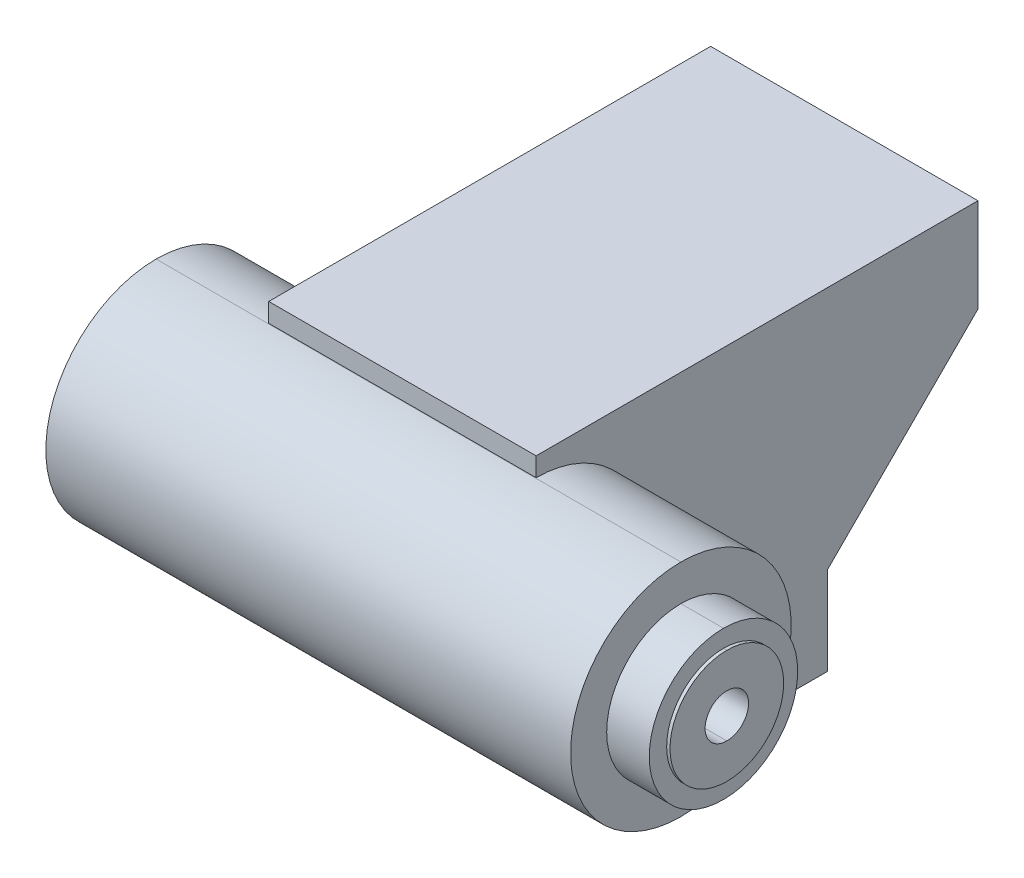
ISO-10303-21;
HEADER;
FILE_DESCRIPTION(('STEP AP214'),'2;1');
FILE_NAME('part.step','',(''),(''),'','','');
FILE_SCHEMA(('AUTOMOTIVE_DESIGN { 1 0 10303 214 1 1 1 1 }'));
ENDSEC;
DATA;
#1=APPLICATION_CONTEXT('core data for automotive mechanical design processes');
#2=APPLICATION_PROTOCOL_DEFINITION('international standard','automotive_design',2000,#1);
#3=PRODUCT_CONTEXT('',#1,'mechanical');
#4=PRODUCT('Part','Part','',(#3));
#5=PRODUCT_RELATED_PRODUCT_CATEGORY('part','',(#4));
#6=PRODUCT_DEFINITION_FORMATION('','',#4);
#7=PRODUCT_DEFINITION_CONTEXT('part definition',#1,'design');
#8=PRODUCT_DEFINITION('design','',#6,#7);
#9=PRODUCT_DEFINITION_SHAPE('','',#8);
#10=(LENGTH_UNIT() NAMED_UNIT(*) SI_UNIT(.MILLI.,.METRE.));
#11=(NAMED_UNIT(*) PLANE_ANGLE_UNIT() SI_UNIT($,.RADIAN.));
#12=(NAMED_UNIT(*) SI_UNIT($,.STERADIAN.) SOLID_ANGLE_UNIT());
#13=UNCERTAINTY_MEASURE_WITH_UNIT(LENGTH_MEASURE(1.E-05),#10,'distance_accuracy_value','');
#14=(GEOMETRIC_REPRESENTATION_CONTEXT(3) GLOBAL_UNCERTAINTY_ASSIGNED_CONTEXT((#13)) GLOBAL_UNIT_ASSIGNED_CONTEXT((#10,
#11,#12)) REPRESENTATION_CONTEXT('',''));
#15=CARTESIAN_POINT('',(0.,0.,0.));
#16=DIRECTION('',(0.,0.,1.));
#17=DIRECTION('',(1.,0.,0.));
#18=AXIS2_PLACEMENT_3D('',#15,#16,#17);
#19=CARTESIAN_POINT('',(-848.7,0.,1.11022302462516E-13));
#20=DIRECTION('',(-1.,0.,0.));
#21=DIRECTION('',(0.,1.,0.));
#22=AXIS2_PLACEMENT_3D('',#19,#20,#21);
#23=CYLINDRICAL_SURFACE('',#22,32.5);
#24=DIRECTION('',(-1.,0.,0.));
#25=VECTOR('',#24,1.);
#26=CARTESIAN_POINT('',(-848.7,-32.5,1.07042200365287E-13));
#27=LINE('',#26,#25);
#28=CARTESIAN_POINT('',(5.,-32.5,0.));
#29=VERTEX_POINT('',#28);
#30=CARTESIAN_POINT('',(-848.7,-32.5,1.11022302462516E-13));
#31=VERTEX_POINT('',#30);
#32=EDGE_CURVE('E36',#29,#31,#27,.T.);
#33=ORIENTED_EDGE('',*,*,#32,.F.);
#34=CARTESIAN_POINT('',(5.,0.,0.));
#35=DIRECTION('',(1.,0.,0.));
#36=DIRECTION('',(0.,-1.,0.));
#37=AXIS2_PLACEMENT_3D('',#34,#35,#36);
#38=CIRCLE('',#37,32.5);
#39=CARTESIAN_POINT('',(5.,32.5,0.));
#40=VERTEX_POINT('',#39);
#41=EDGE_CURVE('E11',#29,#40,#38,.T.);
#42=ORIENTED_EDGE('',*,*,#41,.T.);
#43=DIRECTION('',(1.,0.,0.));
#44=VECTOR('',#43,1.);
#45=CARTESIAN_POINT('',(-848.7,32.5,1.15002404559745E-13));
#46=LINE('',#45,#44);
#47=CARTESIAN_POINT('',(-848.7,32.5,1.15002404559745E-13));
#48=VERTEX_POINT('',#47);
#49=EDGE_CURVE('E228',#48,#40,#46,.T.);
#50=ORIENTED_EDGE('',*,*,#49,.F.);
#51=CARTESIAN_POINT('',(-848.7,0.,1.11022302462516E-13));
#52=DIRECTION('',(-1.,0.,0.));
#53=DIRECTION('',(0.,-1.,0.));
#54=AXIS2_PLACEMENT_3D('',#51,#52,#53);
#55=CIRCLE('',#54,32.5);
#56=EDGE_CURVE('E28',#48,#31,#55,.T.);
#57=ORIENTED_EDGE('',*,*,#56,.T.);
#58=EDGE_LOOP('',(#33,#42,#50,#57));
#59=FACE_BOUND('',#58,.T.);
#60=ADVANCED_FACE('F17',(#59),#23,.F.);
#61=CARTESIAN_POINT('',(-63.7,0.,0.));
#62=DIRECTION('',(-1.,0.,0.));
#63=DIRECTION('',(0.,1.,0.));
#64=AXIS2_PLACEMENT_3D('',#61,#62,#63);
#65=CYLINDRICAL_SURFACE('',#64,165.);
#66=DIRECTION('',(1.,0.,0.));
#67=VECTOR('',#66,1.);
#68=CARTESIAN_POINT('',(-63.7,-165.,0.));
#69=LINE('',#68,#67);
#70=CARTESIAN_POINT('',(-848.7,-165.,1.67976130488033E-13));
#71=VERTEX_POINT('',#70);
#72=CARTESIAN_POINT('',(-681.24,-165.,1.30792540947287E-13));
#73=VERTEX_POINT('',#72);
#74=EDGE_CURVE('E255',#71,#73,#69,.T.);
#75=ORIENTED_EDGE('',*,*,#74,.F.);
#76=CARTESIAN_POINT('',(-848.7,0.,1.88182802673964E-13));
#77=DIRECTION('',(1.,0.,0.));
#78=DIRECTION('',(0.,-1.,0.));
#79=AXIS2_PLACEMENT_3D('',#76,#77,#78);
#80=CIRCLE('',#79,165.);
#81=CARTESIAN_POINT('',(-848.7,164.997791205226,-0.85375488093375));
#82=VERTEX_POINT('',#81);
#83=EDGE_CURVE('E323',#71,#82,#80,.T.);
#84=ORIENTED_EDGE('',*,*,#83,.T.);
#85=CARTESIAN_POINT('',(-848.7,0.,1.88182802673964E-13));
#86=DIRECTION('',(1.,0.,0.));
#87=DIRECTION('',(0.,-1.,0.));
#88=AXIS2_PLACEMENT_3D('',#85,#86,#87);
#89=CIRCLE('',#88,165.);
#90=CARTESIAN_POINT('',(-848.7,165.,2.08389474859895E-13));
#91=VERTEX_POINT('',#90);
#92=EDGE_CURVE('E317',#82,#91,#89,.T.);
#93=ORIENTED_EDGE('',*,*,#92,.T.);
#94=DIRECTION('',(-1.,0.,0.));
#95=VECTOR('',#94,1.);
#96=CARTESIAN_POINT('',(-63.7,165.,0.));
#97=LINE('',#96,#95);
#98=CARTESIAN_POINT('',(-63.7,165.,0.));
#99=VERTEX_POINT('',#98);
#100=EDGE_CURVE('E237',#99,#91,#97,.T.);
#101=ORIENTED_EDGE('',*,*,#100,.F.);
#102=CARTESIAN_POINT('',(-63.7,0.,0.));
#103=DIRECTION('',(-1.,0.,0.));
#104=DIRECTION('',(0.,-1.,0.));
#105=AXIS2_PLACEMENT_3D('',#102,#103,#104);
#106=CIRCLE('',#105,165.);
#107=CARTESIAN_POINT('',(-63.7,-165.,0.));
#108=VERTEX_POINT('',#107);
#109=EDGE_CURVE('E311',#99,#108,#106,.T.);
#110=ORIENTED_EDGE('',*,*,#109,.T.);
#111=DIRECTION('',(1.,0.,0.));
#112=VECTOR('',#111,1.);
#113=CARTESIAN_POINT('',(-63.7,-165.,0.));
#114=LINE('',#113,#112);
#115=CARTESIAN_POINT('',(-281.24,-165.,0.));
#116=VERTEX_POINT('',#115);
#117=EDGE_CURVE('E242',#116,#108,#114,.T.);
#118=ORIENTED_EDGE('',*,*,#117,.F.);
#119=CARTESIAN_POINT('',(-281.24,0.,0.));
#120=DIRECTION('',(1.,0.,0.));
#121=DIRECTION('',(0.,-1.,0.));
#122=AXIS2_PLACEMENT_3D('',#119,#120,#121);
#123=CIRCLE('',#122,165.);
#124=CARTESIAN_POINT('',(-281.24,164.997791205226,-0.853754880933878));
#125=VERTEX_POINT('',#124);
#126=EDGE_CURVE('E307',#116,#125,#123,.T.);
#127=ORIENTED_EDGE('',*,*,#126,.T.);
#128=DIRECTION('',(-1.,0.,0.));
#129=VECTOR('',#128,1.);
#130=CARTESIAN_POINT('',(-481.24,164.997791205226,-0.853754880933834));
#131=LINE('',#130,#129);
#132=CARTESIAN_POINT('',(-681.24,164.997791205226,-0.853754880933789));
#133=VERTEX_POINT('',#132);
#134=EDGE_CURVE('E303',#125,#133,#131,.T.);
#135=ORIENTED_EDGE('',*,*,#134,.T.);
#136=CARTESIAN_POINT('',(-681.24,0.,1.50999213133218E-13));
#137=DIRECTION('',(-1.,0.,0.));
#138=DIRECTION('',(0.,-1.,0.));
#139=AXIS2_PLACEMENT_3D('',#136,#137,#138);
#140=CIRCLE('',#139,165.);
#141=EDGE_CURVE('E292',#133,#73,#140,.T.);
#142=ORIENTED_EDGE('',*,*,#141,.T.);
#143=EDGE_LOOP('',(#75,#84,#93,#101,#110,#118,#127,#135,#142));
#144=FACE_BOUND('',#143,.T.);
#145=ADVANCED_FACE('F360',(#144),#65,.T.);
#146=CARTESIAN_POINT('',(0.,0.,0.));
#147=DIRECTION('',(1.,0.,0.));
#148=DIRECTION('',(0.,-1.,0.));
#149=AXIS2_PLACEMENT_3D('',#146,#147,#148);
#150=CYLINDRICAL_SURFACE('',#149,85.);
#151=DIRECTION('',(-1.,0.,0.));
#152=VECTOR('',#151,1.);
#153=CARTESIAN_POINT('',(0.,85.,0.));
#154=LINE('',#153,#152);
#155=CARTESIAN_POINT('',(5.,85.,0.));
#156=VERTEX_POINT('',#155);
#157=CARTESIAN_POINT('',(0.,85.,0.));
#158=VERTEX_POINT('',#157);
#159=EDGE_CURVE('E264',#156,#158,#154,.T.);
#160=ORIENTED_EDGE('',*,*,#159,.F.);
#161=CARTESIAN_POINT('',(5.,0.,0.));
#162=DIRECTION('',(1.,0.,0.));
#163=DIRECTION('',(0.,1.,0.));
#164=AXIS2_PLACEMENT_3D('',#161,#162,#163);
#165=CIRCLE('',#164,85.);
#166=CARTESIAN_POINT('',(5.,-85.,0.));
#167=VERTEX_POINT('',#166);
#168=EDGE_CURVE('E259',#167,#156,#165,.T.);
#169=ORIENTED_EDGE('',*,*,#168,.F.);
#170=DIRECTION('',(1.,0.,0.));
#171=VECTOR('',#170,1.);
#172=CARTESIAN_POINT('',(0.,-85.,0.));
#173=LINE('',#172,#171);
#174=CARTESIAN_POINT('',(0.,-85.,0.));
#175=VERTEX_POINT('',#174);
#176=EDGE_CURVE('E265',#175,#167,#173,.T.);
#177=ORIENTED_EDGE('',*,*,#176,.F.);
#178=CARTESIAN_POINT('',(0.,0.,0.));
#179=DIRECTION('',(1.,0.,0.));
#180=DIRECTION('',(0.,1.,0.));
#181=AXIS2_PLACEMENT_3D('',#178,#179,#180);
#182=CIRCLE('',#181,85.);
#183=EDGE_CURVE('E286',#175,#158,#182,.T.);
#184=ORIENTED_EDGE('',*,*,#183,.T.);
#185=EDGE_LOOP('',(#160,#169,#177,#184));
#186=FACE_BOUND('',#185,.T.);
#187=ADVANCED_FACE('F366',(#186),#150,.T.);
#188=CARTESIAN_POINT('',(0.,0.,0.));
#189=DIRECTION('',(-1.,0.,0.));
#190=DIRECTION('',(0.,1.,0.));
#191=AXIS2_PLACEMENT_3D('',#188,#189,#190);
#192=CYLINDRICAL_SURFACE('',#191,111.);
#193=DIRECTION('',(1.,0.,0.));
#194=VECTOR('',#193,1.);
#195=CARTESIAN_POINT('',(0.,-111.,0.));
#196=LINE('',#195,#194);
#197=CARTESIAN_POINT('',(-63.7,-111.,0.));
#198=VERTEX_POINT('',#197);
#199=CARTESIAN_POINT('',(0.,-111.,0.));
#200=VERTEX_POINT('',#199);
#201=EDGE_CURVE('E275',#198,#200,#196,.T.);
#202=ORIENTED_EDGE('',*,*,#201,.F.);
#203=CARTESIAN_POINT('',(-63.7,0.,0.));
#204=DIRECTION('',(1.,0.,0.));
#205=DIRECTION('',(0.,-1.,0.));
#206=AXIS2_PLACEMENT_3D('',#203,#204,#205);
#207=CIRCLE('',#206,111.);
#208=CARTESIAN_POINT('',(-63.7,111.,0.));
#209=VERTEX_POINT('',#208);
#210=EDGE_CURVE('E280',#198,#209,#207,.T.);
#211=ORIENTED_EDGE('',*,*,#210,.T.);
#212=DIRECTION('',(-1.,0.,0.));
#213=VECTOR('',#212,1.);
#214=CARTESIAN_POINT('',(0.,111.,0.));
#215=LINE('',#214,#213);
#216=CARTESIAN_POINT('',(0.,111.,0.));
#217=VERTEX_POINT('',#216);
#218=EDGE_CURVE('E270',#217,#209,#215,.T.);
#219=ORIENTED_EDGE('',*,*,#218,.F.);
#220=CARTESIAN_POINT('',(0.,0.,0.));
#221=DIRECTION('',(-1.,0.,0.));
#222=DIRECTION('',(0.,-1.,0.));
#223=AXIS2_PLACEMENT_3D('',#220,#221,#222);
#224=CIRCLE('',#223,111.);
#225=EDGE_CURVE('E276',#217,#200,#224,.T.);
#226=ORIENTED_EDGE('',*,*,#225,.T.);
#227=EDGE_LOOP('',(#202,#211,#219,#226));
#228=FACE_BOUND('',#227,.T.);
#229=ADVANCED_FACE('F372',(#228),#192,.T.);
#230=CARTESIAN_POINT('',(0.,0.,0.));
#231=DIRECTION('',(-1.,0.,0.));
#232=DIRECTION('',(0.,1.,0.));
#233=AXIS2_PLACEMENT_3D('',#230,#231,#232);
#234=CYLINDRICAL_SURFACE('',#233,111.);
#235=ORIENTED_EDGE('',*,*,#201,.T.);
#236=CARTESIAN_POINT('',(0.,0.,0.));
#237=DIRECTION('',(-1.,0.,0.));
#238=DIRECTION('',(0.,-1.,0.));
#239=AXIS2_PLACEMENT_3D('',#236,#237,#238);
#240=CIRCLE('',#239,111.);
#241=EDGE_CURVE('E271',#200,#217,#240,.T.);
#242=ORIENTED_EDGE('',*,*,#241,.T.);
#243=ORIENTED_EDGE('',*,*,#218,.T.);
#244=CARTESIAN_POINT('',(-63.7,0.,0.));
#245=DIRECTION('',(1.,0.,0.));
#246=DIRECTION('',(0.,-1.,0.));
#247=AXIS2_PLACEMENT_3D('',#244,#245,#246);
#248=CIRCLE('',#247,111.);
#249=EDGE_CURVE('E266',#209,#198,#248,.T.);
#250=ORIENTED_EDGE('',*,*,#249,.T.);
#251=EDGE_LOOP('',(#235,#242,#243,#250));
#252=FACE_BOUND('',#251,.T.);
#253=ADVANCED_FACE('F376',(#252),#234,.T.);
#254=CARTESIAN_POINT('',(0.,0.,0.));
#255=DIRECTION('',(1.,0.,0.));
#256=DIRECTION('',(0.,-1.,0.));
#257=AXIS2_PLACEMENT_3D('',#254,#255,#256);
#258=CYLINDRICAL_SURFACE('',#257,85.);
#259=ORIENTED_EDGE('',*,*,#159,.T.);
#260=CARTESIAN_POINT('',(0.,0.,0.));
#261=DIRECTION('',(1.,0.,0.));
#262=DIRECTION('',(0.,1.,0.));
#263=AXIS2_PLACEMENT_3D('',#260,#261,#262);
#264=CIRCLE('',#263,85.);
#265=EDGE_CURVE('E260',#158,#175,#264,.T.);
#266=ORIENTED_EDGE('',*,*,#265,.T.);
#267=ORIENTED_EDGE('',*,*,#176,.T.);
#268=CARTESIAN_POINT('',(5.,0.,0.));
#269=DIRECTION('',(1.,0.,0.));
#270=DIRECTION('',(0.,1.,0.));
#271=AXIS2_PLACEMENT_3D('',#268,#269,#270);
#272=CIRCLE('',#271,85.);
#273=EDGE_CURVE('E188',#156,#167,#272,.T.);
#274=ORIENTED_EDGE('',*,*,#273,.F.);
#275=EDGE_LOOP('',(#259,#266,#267,#274));
#276=FACE_BOUND('',#275,.T.);
#277=ADVANCED_FACE('F380',(#276),#258,.T.);
#278=CARTESIAN_POINT('',(-63.7,0.,0.));
#279=DIRECTION('',(-1.,0.,0.));
#280=DIRECTION('',(0.,1.,0.));
#281=AXIS2_PLACEMENT_3D('',#278,#279,#280);
#282=CYLINDRICAL_SURFACE('',#281,165.);
#283=ORIENTED_EDGE('',*,*,#74,.T.);
#284=CARTESIAN_POINT('',(-681.24,0.,1.50999213133218E-13));
#285=DIRECTION('',(-1.,0.,0.));
#286=DIRECTION('',(0.,-1.,0.));
#287=AXIS2_PLACEMENT_3D('',#284,#285,#286);
#288=CIRCLE('',#287,165.);
#289=CARTESIAN_POINT('',(-681.24,-157.241851935164,50.));
#290=VERTEX_POINT('',#289);
#291=EDGE_CURVE('E251',#73,#290,#288,.T.);
#292=ORIENTED_EDGE('',*,*,#291,.T.);
#293=DIRECTION('',(1.,0.,0.));
#294=VECTOR('',#293,1.);
#295=CARTESIAN_POINT('',(-481.24,-157.241851935164,50.));
#296=LINE('',#295,#294);
#297=CARTESIAN_POINT('',(-281.24,-157.241851935164,50.));
#298=VERTEX_POINT('',#297);
#299=EDGE_CURVE('E247',#290,#298,#296,.T.);
#300=ORIENTED_EDGE('',*,*,#299,.T.);
#301=CARTESIAN_POINT('',(-281.24,0.,0.));
#302=DIRECTION('',(1.,0.,0.));
#303=DIRECTION('',(0.,-1.,0.));
#304=AXIS2_PLACEMENT_3D('',#301,#302,#303);
#305=CIRCLE('',#304,165.);
#306=EDGE_CURVE('E243',#298,#116,#305,.T.);
#307=ORIENTED_EDGE('',*,*,#306,.T.);
#308=ORIENTED_EDGE('',*,*,#117,.T.);
#309=CARTESIAN_POINT('',(-63.7,0.,0.));
#310=DIRECTION('',(-1.,0.,0.));
#311=DIRECTION('',(0.,-1.,0.));
#312=AXIS2_PLACEMENT_3D('',#309,#310,#311);
#313=CIRCLE('',#312,165.);
#314=EDGE_CURVE('E238',#108,#99,#313,.T.);
#315=ORIENTED_EDGE('',*,*,#314,.T.);
#316=ORIENTED_EDGE('',*,*,#100,.T.);
#317=CARTESIAN_POINT('',(-848.7,0.,1.88182802673964E-13));
#318=DIRECTION('',(1.,0.,0.));
#319=DIRECTION('',(0.,-1.,0.));
#320=AXIS2_PLACEMENT_3D('',#317,#318,#319);
#321=CIRCLE('',#320,165.);
#322=EDGE_CURVE('E233',#91,#71,#321,.T.);
#323=ORIENTED_EDGE('',*,*,#322,.T.);
#324=EDGE_LOOP('',(#283,#292,#300,#307,#308,#315,#316,#323));
#325=FACE_BOUND('',#324,.T.);
#326=ADVANCED_FACE('F384',(#325),#282,.T.);
#327=CARTESIAN_POINT('',(-848.7,0.,1.11022302462516E-13));
#328=DIRECTION('',(-1.,0.,0.));
#329=DIRECTION('',(0.,1.,0.));
#330=AXIS2_PLACEMENT_3D('',#327,#328,#329);
#331=CYLINDRICAL_SURFACE('',#330,32.5);
#332=ORIENTED_EDGE('',*,*,#32,.T.);
#333=CARTESIAN_POINT('',(-848.7,0.,1.11022302462516E-13));
#334=DIRECTION('',(-1.,0.,0.));
#335=DIRECTION('',(0.,-1.,0.));
#336=AXIS2_PLACEMENT_3D('',#333,#334,#335);
#337=CIRCLE('',#336,32.5);
#338=EDGE_CURVE('E229',#31,#48,#337,.T.);
#339=ORIENTED_EDGE('',*,*,#338,.T.);
#340=ORIENTED_EDGE('',*,*,#49,.T.);
#341=CARTESIAN_POINT('',(5.,0.,0.));
#342=DIRECTION('',(1.,0.,0.));
#343=DIRECTION('',(0.,-1.,0.));
#344=AXIS2_PLACEMENT_3D('',#341,#342,#343);
#345=CIRCLE('',#344,32.5);
#346=EDGE_CURVE('E224',#40,#29,#345,.T.);
#347=ORIENTED_EDGE('',*,*,#346,.T.);
#348=EDGE_LOOP('',(#332,#339,#340,#347));
#349=FACE_BOUND('',#348,.T.);
#350=ADVANCED_FACE('F337',(#349),#331,.F.);
#351=CARTESIAN_POINT('',(-681.24,-59.5,-549.5));
#352=DIRECTION('',(0.,-0.707106781186548,-0.707106781186547));
#353=DIRECTION('',(0.,-0.707106781186547,0.707106781186548));
#354=AXIS2_PLACEMENT_3D('',#351,#352,#353);
#355=PLANE('',#354);
#356=DIRECTION('',(0.,-0.707106781186547,0.707106781186548));
#357=VECTOR('',#356,1.);
#358=CARTESIAN_POINT('',(-281.24,-172.,-437.));
#359=LINE('',#358,#357);
#360=CARTESIAN_POINT('',(-281.24,52.9999999999994,-662.));
#361=VERTEX_POINT('',#360);
#362=CARTESIAN_POINT('',(-281.24,-172.,-437.));
#363=VERTEX_POINT('',#362);
#364=EDGE_CURVE('E218',#361,#363,#359,.T.);
#365=ORIENTED_EDGE('',*,*,#364,.T.);
#366=DIRECTION('',(1.,0.,0.));
#367=VECTOR('',#366,1.);
#368=CARTESIAN_POINT('',(-681.24,-172.,-437.));
#369=LINE('',#368,#367);
#370=CARTESIAN_POINT('',(-681.24,-172.,-437.));
#371=VERTEX_POINT('',#370);
#372=EDGE_CURVE('E202',#371,#363,#369,.T.);
#373=ORIENTED_EDGE('',*,*,#372,.F.);
#374=DIRECTION('',(0.,0.707106781186547,-0.707106781186548));
#375=VECTOR('',#374,1.);
#376=CARTESIAN_POINT('',(-681.24,-172.,-437.));
#377=LINE('',#376,#375);
#378=CARTESIAN_POINT('',(-681.24,52.9999999999994,-662.));
#379=VERTEX_POINT('',#378);
#380=EDGE_CURVE('E215',#371,#379,#377,.T.);
#381=ORIENTED_EDGE('',*,*,#380,.T.);
#382=DIRECTION('',(1.,0.,0.));
#383=VECTOR('',#382,1.);
#384=CARTESIAN_POINT('',(-681.24,52.9999999999994,-662.));
#385=LINE('',#384,#383);
#386=EDGE_CURVE('E162',#379,#361,#385,.T.);
#387=ORIENTED_EDGE('',*,*,#386,.T.);
#388=EDGE_LOOP('',(#365,#373,#381,#387));
#389=FACE_BOUND('',#388,.T.);
#390=ADVANCED_FACE('F391',(#389),#355,.T.);
#391=CARTESIAN_POINT('',(-681.24,-237.999999999984,-437.));
#392=DIRECTION('',(0.,0.,-1.));
#393=DIRECTION('',(0.,1.,0.));
#394=AXIS2_PLACEMENT_3D('',#391,#392,#393);
#395=PLANE('',#394);
#396=DIRECTION('',(0.,-1.,0.));
#397=VECTOR('',#396,1.);
#398=CARTESIAN_POINT('',(-281.24,-303.999999999968,-437.));
#399=LINE('',#398,#397);
#400=CARTESIAN_POINT('',(-281.24,-303.999999999968,-437.));
#401=VERTEX_POINT('',#400);
#402=EDGE_CURVE('E207',#363,#401,#399,.T.);
#403=ORIENTED_EDGE('',*,*,#402,.T.);
#404=DIRECTION('',(1.,0.,0.));
#405=VECTOR('',#404,1.);
#406=CARTESIAN_POINT('',(-681.24,-303.999999999968,-437.));
#407=LINE('',#406,#405);
#408=CARTESIAN_POINT('',(-681.24,-303.999999999968,-437.));
#409=VERTEX_POINT('',#408);
#410=EDGE_CURVE('E193',#409,#401,#407,.T.);
#411=ORIENTED_EDGE('',*,*,#410,.F.);
#412=DIRECTION('',(0.,1.,0.));
#413=VECTOR('',#412,1.);
#414=CARTESIAN_POINT('',(-681.24,-303.999999999968,-437.));
#415=LINE('',#414,#413);
#416=EDGE_CURVE('E203',#409,#371,#415,.T.);
#417=ORIENTED_EDGE('',*,*,#416,.T.);
#418=ORIENTED_EDGE('',*,*,#372,.T.);
#419=EDGE_LOOP('',(#403,#411,#417,#418));
#420=FACE_BOUND('',#419,.T.);
#421=ADVANCED_FACE('F394',(#420),#395,.T.);
#422=CARTESIAN_POINT('',(-681.24,-303.999999999968,-397.));
#423=DIRECTION('',(0.,-1.,0.));
#424=DIRECTION('',(0.,0.,1.));
#425=AXIS2_PLACEMENT_3D('',#422,#423,#424);
#426=PLANE('',#425);
#427=DIRECTION('',(0.,0.,1.));
#428=VECTOR('',#427,1.);
#429=CARTESIAN_POINT('',(-281.24,-303.999999999968,-437.));
#430=LINE('',#429,#428);
#431=CARTESIAN_POINT('',(-281.24,-303.999999999968,-357.));
#432=VERTEX_POINT('',#431);
#433=EDGE_CURVE('E198',#401,#432,#430,.T.);
#434=ORIENTED_EDGE('',*,*,#433,.T.);
#435=DIRECTION('',(1.,0.,0.));
#436=VECTOR('',#435,1.);
#437=CARTESIAN_POINT('',(-681.24,-303.999999999968,-357.));
#438=LINE('',#437,#436);
#439=CARTESIAN_POINT('',(-681.24,-303.999999999968,-357.));
#440=VERTEX_POINT('',#439);
#441=EDGE_CURVE('E183',#440,#432,#438,.T.);
#442=ORIENTED_EDGE('',*,*,#441,.F.);
#443=DIRECTION('',(0.,0.,1.));
#444=VECTOR('',#443,1.);
#445=CARTESIAN_POINT('',(-681.24,-303.999999999968,-437.));
#446=LINE('',#445,#444);
#447=EDGE_CURVE('E149',#409,#440,#446,.T.);
#448=ORIENTED_EDGE('',*,*,#447,.F.);
#449=ORIENTED_EDGE('',*,*,#410,.T.);
#450=EDGE_LOOP('',(#434,#442,#448,#449));
#451=FACE_BOUND('',#450,.T.);
#452=ADVANCED_FACE('F398',(#451),#426,.T.);
#453=CARTESIAN_POINT('',(-681.24,-230.620925967566,-153.5));
#454=DIRECTION('',(0.,-0.940711862462827,0.339206709576504));
#455=DIRECTION('',(1.,0.,0.));
#456=AXIS2_PLACEMENT_3D('',#453,#454,#455);
#457=PLANE('',#456);
#458=DIRECTION('',(0.,0.339206709576504,0.940711862462827));
#459=VECTOR('',#458,1.);
#460=CARTESIAN_POINT('',(-281.24,-303.999999999968,-357.));
#461=LINE('',#460,#459);
#462=EDGE_CURVE('E189',#432,#298,#461,.T.);
#463=ORIENTED_EDGE('',*,*,#462,.T.);
#464=ORIENTED_EDGE('',*,*,#299,.F.);
#465=DIRECTION('',(0.,0.339206709576504,0.940711862462827));
#466=VECTOR('',#465,1.);
#467=CARTESIAN_POINT('',(-681.24,-303.999999999968,-357.));
#468=LINE('',#467,#466);
#469=EDGE_CURVE('E184',#440,#290,#468,.T.);
#470=ORIENTED_EDGE('',*,*,#469,.F.);
#471=ORIENTED_EDGE('',*,*,#441,.T.);
#472=EDGE_LOOP('',(#463,#464,#470,#471));
#473=FACE_BOUND('',#472,.T.);
#474=ADVANCED_FACE('F402',(#473),#457,.T.);
#475=CARTESIAN_POINT('',(-681.24,179.129553236294,-0.926877440466804));
#476=DIRECTION('',(0.,0.0051742720056598,0.999986613365005));
#477=DIRECTION('',(-1.,0.,0.));
#478=AXIS2_PLACEMENT_3D('',#475,#476,#477);
#479=PLANE('',#478);
#480=DIRECTION('',(0.,0.999986613365005,-0.0051742720056598));
#481=VECTOR('',#480,1.);
#482=CARTESIAN_POINT('',(-281.24,193.261315267362,-0.99999999999993));
#483=LINE('',#482,#481);
#484=CARTESIAN_POINT('',(-281.24,193.261315267362,-0.999999999999907));
#485=VERTEX_POINT('',#484);
#486=EDGE_CURVE('E178',#125,#485,#483,.T.);
#487=ORIENTED_EDGE('',*,*,#486,.T.);
#488=DIRECTION('',(1.,0.,0.));
#489=VECTOR('',#488,1.);
#490=CARTESIAN_POINT('',(-681.24,193.261315267362,-0.999999999999818));
#491=LINE('',#490,#489);
#492=CARTESIAN_POINT('',(-681.24,193.261315267362,-0.999999999999818));
#493=VERTEX_POINT('',#492);
#494=EDGE_CURVE('E159',#493,#485,#491,.T.);
#495=ORIENTED_EDGE('',*,*,#494,.F.);
#496=DIRECTION('',(0.,-0.999986613365005,0.0051742720056598));
#497=VECTOR('',#496,1.);
#498=CARTESIAN_POINT('',(-681.24,193.261315267362,-0.999999999999819));
#499=LINE('',#498,#497);
#500=EDGE_CURVE('E157',#493,#133,#499,.T.);
#501=ORIENTED_EDGE('',*,*,#500,.T.);
#502=ORIENTED_EDGE('',*,*,#134,.F.);
#503=EDGE_LOOP('',(#487,#495,#501,#502));
#504=FACE_BOUND('',#503,.T.);
#505=ADVANCED_FACE('F406',(#504),#479,.T.);
#506=CARTESIAN_POINT('',(-681.24,193.261315267362,-331.5));
#507=DIRECTION('',(0.,1.,0.));
#508=DIRECTION('',(-1.,0.,0.));
#509=AXIS2_PLACEMENT_3D('',#506,#507,#508);
#510=PLANE('',#509);
#511=DIRECTION('',(0.,0.,-1.));
#512=VECTOR('',#511,1.);
#513=CARTESIAN_POINT('',(-281.24,193.261315267362,-662.));
#514=LINE('',#513,#512);
#515=CARTESIAN_POINT('',(-281.24,193.261315267362,-662.));
#516=VERTEX_POINT('',#515);
#517=EDGE_CURVE('E146',#485,#516,#514,.T.);
#518=ORIENTED_EDGE('',*,*,#517,.T.);
#519=DIRECTION('',(1.,0.,0.));
#520=VECTOR('',#519,1.);
#521=CARTESIAN_POINT('',(-681.24,193.261315267362,-662.));
#522=LINE('',#521,#520);
#523=CARTESIAN_POINT('',(-681.24,193.261315267362,-662.));
#524=VERTEX_POINT('',#523);
#525=EDGE_CURVE('E138',#524,#516,#522,.T.);
#526=ORIENTED_EDGE('',*,*,#525,.F.);
#527=DIRECTION('',(0.,0.,1.));
#528=VECTOR('',#527,1.);
#529=CARTESIAN_POINT('',(-681.24,193.261315267362,-662.));
#530=LINE('',#529,#528);
#531=EDGE_CURVE('E144',#524,#493,#530,.T.);
#532=ORIENTED_EDGE('',*,*,#531,.T.);
#533=ORIENTED_EDGE('',*,*,#494,.T.);
#534=EDGE_LOOP('',(#518,#526,#532,#533));
#535=FACE_BOUND('',#534,.T.);
#536=ADVANCED_FACE('F143',(#535),#510,.T.);
#537=CARTESIAN_POINT('',(-681.24,123.130657633681,-662.));
#538=DIRECTION('',(0.,0.,-1.));
#539=DIRECTION('',(1.,0.,0.));
#540=AXIS2_PLACEMENT_3D('',#537,#538,#539);
#541=PLANE('',#540);
#542=DIRECTION('',(0.,-1.,0.));
#543=VECTOR('',#542,1.);
#544=CARTESIAN_POINT('',(-281.24,52.9999999999994,-662.));
#545=LINE('',#544,#543);
#546=EDGE_CURVE('E165',#516,#361,#545,.T.);
#547=ORIENTED_EDGE('',*,*,#546,.T.);
#548=ORIENTED_EDGE('',*,*,#386,.F.);
#549=DIRECTION('',(0.,1.,0.));
#550=VECTOR('',#549,1.);
#551=CARTESIAN_POINT('',(-681.24,52.9999999999994,-662.));
#552=LINE('',#551,#550);
#553=EDGE_CURVE('E21',#379,#524,#552,.T.);
#554=ORIENTED_EDGE('',*,*,#553,.T.);
#555=ORIENTED_EDGE('',*,*,#525,.T.);
#556=EDGE_LOOP('',(#547,#548,#554,#555));
#557=FACE_BOUND('',#556,.T.);
#558=ADVANCED_FACE('F161',(#557),#541,.T.);
#559=CARTESIAN_POINT('',(-281.24,0.,0.));
#560=DIRECTION('',(-1.,0.,0.));
#561=DIRECTION('',(0.,-1.,0.));
#562=AXIS2_PLACEMENT_3D('',#559,#560,#561);
#563=PLANE('',#562);
#564=ORIENTED_EDGE('',*,*,#364,.F.);
#565=ORIENTED_EDGE('',*,*,#546,.F.);
#566=ORIENTED_EDGE('',*,*,#517,.F.);
#567=ORIENTED_EDGE('',*,*,#486,.F.);
#568=ORIENTED_EDGE('',*,*,#126,.F.);
#569=ORIENTED_EDGE('',*,*,#306,.F.);
#570=ORIENTED_EDGE('',*,*,#462,.F.);
#571=ORIENTED_EDGE('',*,*,#433,.F.);
#572=ORIENTED_EDGE('',*,*,#402,.F.);
#573=EDGE_LOOP('',(#564,#565,#566,#567,#568,#569,#570,#571,#572));
#574=FACE_BOUND('',#573,.T.);
#575=ADVANCED_FACE('F356',(#574),#563,.F.);
#576=CARTESIAN_POINT('',(-681.24,0.,1.49085970348531E-13));
#577=DIRECTION('',(-1.,0.,0.));
#578=DIRECTION('',(0.,-1.,0.));
#579=AXIS2_PLACEMENT_3D('',#576,#577,#578);
#580=PLANE('',#579);
#581=ORIENTED_EDGE('',*,*,#553,.F.);
#582=ORIENTED_EDGE('',*,*,#380,.F.);
#583=ORIENTED_EDGE('',*,*,#416,.F.);
#584=ORIENTED_EDGE('',*,*,#447,.T.);
#585=ORIENTED_EDGE('',*,*,#469,.T.);
#586=ORIENTED_EDGE('',*,*,#291,.F.);
#587=ORIENTED_EDGE('',*,*,#141,.F.);
#588=ORIENTED_EDGE('',*,*,#500,.F.);
#589=ORIENTED_EDGE('',*,*,#531,.F.);
#590=EDGE_LOOP('',(#581,#582,#583,#584,#585,#586,#587,#588,#589));
#591=FACE_BOUND('',#590,.T.);
#592=ADVANCED_FACE('F154',(#591),#580,.T.);
#593=CARTESIAN_POINT('',(-848.7,0.,1.88449256199874E-13));
#594=DIRECTION('',(-1.,0.,0.));
#595=DIRECTION('',(0.,-1.,0.));
#596=AXIS2_PLACEMENT_3D('',#593,#594,#595);
#597=PLANE('',#596);
#598=ORIENTED_EDGE('',*,*,#92,.F.);
#599=ORIENTED_EDGE('',*,*,#83,.F.);
#600=ORIENTED_EDGE('',*,*,#322,.F.);
#601=EDGE_LOOP('',(#598,#599,#600));
#602=FACE_BOUND('',#601,.T.);
#603=ORIENTED_EDGE('',*,*,#338,.F.);
#604=ORIENTED_EDGE('',*,*,#56,.F.);
#605=EDGE_LOOP('',(#603,#604));
#606=FACE_BOUND('',#605,.T.);
#607=ADVANCED_FACE('F342',(#602,#606),#597,.T.);
#608=CARTESIAN_POINT('',(5.,0.,0.));
#609=DIRECTION('',(-1.,0.,0.));
#610=DIRECTION('',(0.,-1.,0.));
#611=AXIS2_PLACEMENT_3D('',#608,#609,#610);
#612=PLANE('',#611);
#613=ORIENTED_EDGE('',*,*,#273,.T.);
#614=ORIENTED_EDGE('',*,*,#168,.T.);
#615=EDGE_LOOP('',(#613,#614));
#616=FACE_BOUND('',#615,.T.);
#617=ORIENTED_EDGE('',*,*,#41,.F.);
#618=ORIENTED_EDGE('',*,*,#346,.F.);
#619=EDGE_LOOP('',(#617,#618));
#620=FACE_BOUND('',#619,.T.);
#621=ADVANCED_FACE('F344',(#616,#620),#612,.F.);
#622=CARTESIAN_POINT('',(-63.7,0.,0.));
#623=DIRECTION('',(-1.,0.,0.));
#624=DIRECTION('',(0.,-1.,0.));
#625=AXIS2_PLACEMENT_3D('',#622,#623,#624);
#626=PLANE('',#625);
#627=ORIENTED_EDGE('',*,*,#109,.F.);
#628=ORIENTED_EDGE('',*,*,#314,.F.);
#629=EDGE_LOOP('',(#627,#628));
#630=FACE_BOUND('',#629,.T.);
#631=ORIENTED_EDGE('',*,*,#249,.F.);
#632=ORIENTED_EDGE('',*,*,#210,.F.);
#633=EDGE_LOOP('',(#631,#632));
#634=FACE_BOUND('',#633,.T.);
#635=ADVANCED_FACE('F353',(#630,#634),#626,.F.);
#636=CARTESIAN_POINT('',(0.,0.,0.));
#637=DIRECTION('',(-1.,0.,0.));
#638=DIRECTION('',(0.,-1.,0.));
#639=AXIS2_PLACEMENT_3D('',#636,#637,#638);
#640=PLANE('',#639);
#641=ORIENTED_EDGE('',*,*,#225,.F.);
#642=ORIENTED_EDGE('',*,*,#241,.F.);
#643=EDGE_LOOP('',(#641,#642));
#644=FACE_BOUND('',#643,.T.);
#645=ORIENTED_EDGE('',*,*,#265,.F.);
#646=ORIENTED_EDGE('',*,*,#183,.F.);
#647=EDGE_LOOP('',(#645,#646));
#648=FACE_BOUND('',#647,.T.);
#649=ADVANCED_FACE('F19',(#644,#648),#640,.F.);
#650=CLOSED_SHELL('',(#60,#145,#187,#229,#253,#277,#326,#350,#390,#421,#452,#474,#505,#536,#558,
#575,#592,#607,#621,#635,#649));
#651=MANIFOLD_SOLID_BREP('B1',#650);
#652=ADVANCED_BREP_SHAPE_REPRESENTATION('',(#18,#651),#14);
#653=SHAPE_DEFINITION_REPRESENTATION(#9,#652);
ENDSEC;
END-ISO-10303-21;
